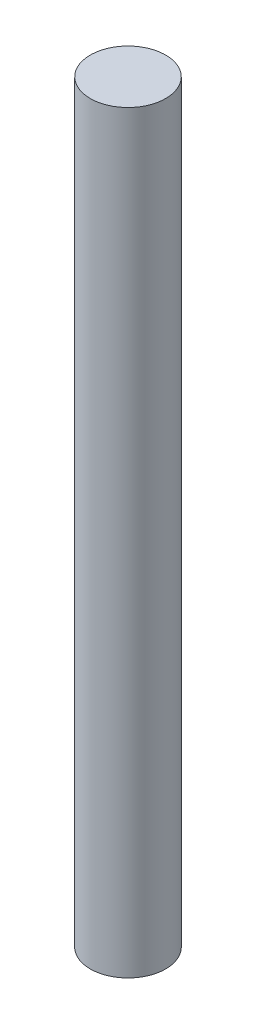
ISO-10303-21;
HEADER;
FILE_DESCRIPTION(('STEP AP214'),'2;1');
FILE_NAME('part.step','',(''),(''),'','','');
FILE_SCHEMA(('AUTOMOTIVE_DESIGN { 1 0 10303 214 1 1 1 1 }'));
ENDSEC;
DATA;
#1=APPLICATION_CONTEXT('core data for automotive mechanical design processes');
#2=APPLICATION_PROTOCOL_DEFINITION('international standard','automotive_design',2000,#1);
#3=PRODUCT_CONTEXT('',#1,'mechanical');
#4=PRODUCT('Part','Part','',(#3));
#5=PRODUCT_RELATED_PRODUCT_CATEGORY('part','',(#4));
#6=PRODUCT_DEFINITION_FORMATION('','',#4);
#7=PRODUCT_DEFINITION_CONTEXT('part definition',#1,'design');
#8=PRODUCT_DEFINITION('design','',#6,#7);
#9=PRODUCT_DEFINITION_SHAPE('','',#8);
#10=(LENGTH_UNIT() NAMED_UNIT(*) SI_UNIT(.MILLI.,.METRE.));
#11=(NAMED_UNIT(*) PLANE_ANGLE_UNIT() SI_UNIT($,.RADIAN.));
#12=(NAMED_UNIT(*) SI_UNIT($,.STERADIAN.) SOLID_ANGLE_UNIT());
#13=UNCERTAINTY_MEASURE_WITH_UNIT(LENGTH_MEASURE(1.E-05),#10,'distance_accuracy_value','');
#14=(GEOMETRIC_REPRESENTATION_CONTEXT(3) GLOBAL_UNCERTAINTY_ASSIGNED_CONTEXT((#13)) GLOBAL_UNIT_ASSIGNED_CONTEXT((#10,
#11,#12)) REPRESENTATION_CONTEXT('',''));
#15=CARTESIAN_POINT('',(0.,0.,0.));
#16=DIRECTION('',(0.,0.,1.));
#17=DIRECTION('',(1.,0.,0.));
#18=AXIS2_PLACEMENT_3D('',#15,#16,#17);
#19=CARTESIAN_POINT('',(0.,30.,0.));
#20=DIRECTION('',(0.,-1.,0.));
#21=DIRECTION('',(0.,0.,-1.));
#22=AXIS2_PLACEMENT_3D('',#19,#20,#21);
#23=CYLINDRICAL_SURFACE('',#22,1.5);
#24=CARTESIAN_POINT('',(0.,30.,0.));
#25=DIRECTION('',(0.,1.,0.));
#26=DIRECTION('',(0.,0.,1.));
#27=AXIS2_PLACEMENT_3D('',#24,#25,#26);
#28=CIRCLE('',#27,1.5);
#29=CARTESIAN_POINT('',(0.,30.,1.5));
#30=VERTEX_POINT('',#29);
#31=EDGE_CURVE('E10',#30,#30,#28,.T.);
#32=ORIENTED_EDGE('',*,*,#31,.F.);
#33=EDGE_LOOP('',(#32));
#34=FACE_BOUND('',#33,.T.);
#35=CARTESIAN_POINT('',(0.,0.,0.));
#36=DIRECTION('',(0.,1.,0.));
#37=DIRECTION('',(0.,0.,1.));
#38=AXIS2_PLACEMENT_3D('',#35,#36,#37);
#39=CIRCLE('',#38,1.5);
#40=CARTESIAN_POINT('',(0.,0.,1.5));
#41=VERTEX_POINT('',#40);
#42=EDGE_CURVE('E40',#41,#41,#39,.T.);
#43=ORIENTED_EDGE('',*,*,#42,.T.);
#44=EDGE_LOOP('',(#43));
#45=FACE_BOUND('',#44,.T.);
#46=ADVANCED_FACE('F37',(#34,#45),#23,.T.);
#47=CARTESIAN_POINT('',(0.,30.,0.));
#48=DIRECTION('',(0.,1.,0.));
#49=DIRECTION('',(0.,0.,1.));
#50=AXIS2_PLACEMENT_3D('',#47,#48,#49);
#51=PLANE('',#50);
#52=ORIENTED_EDGE('',*,*,#31,.T.);
#53=EDGE_LOOP('',(#52));
#54=FACE_BOUND('',#53,.T.);
#55=ADVANCED_FACE('F52',(#54),#51,.T.);
#56=CARTESIAN_POINT('',(0.,0.,0.));
#57=DIRECTION('',(0.,1.,0.));
#58=DIRECTION('',(0.,0.,1.));
#59=AXIS2_PLACEMENT_3D('',#56,#57,#58);
#60=PLANE('',#59);
#61=ORIENTED_EDGE('',*,*,#42,.F.);
#62=EDGE_LOOP('',(#61));
#63=FACE_BOUND('',#62,.T.);
#64=ADVANCED_FACE('F50',(#63),#60,.F.);
#65=CLOSED_SHELL('',(#46,#55,#64));
#66=MANIFOLD_SOLID_BREP('B2',#65);
#67=ADVANCED_BREP_SHAPE_REPRESENTATION('',(#18,#66),#14);
#68=SHAPE_DEFINITION_REPRESENTATION(#9,#67);
ENDSEC;
END-ISO-10303-21;
